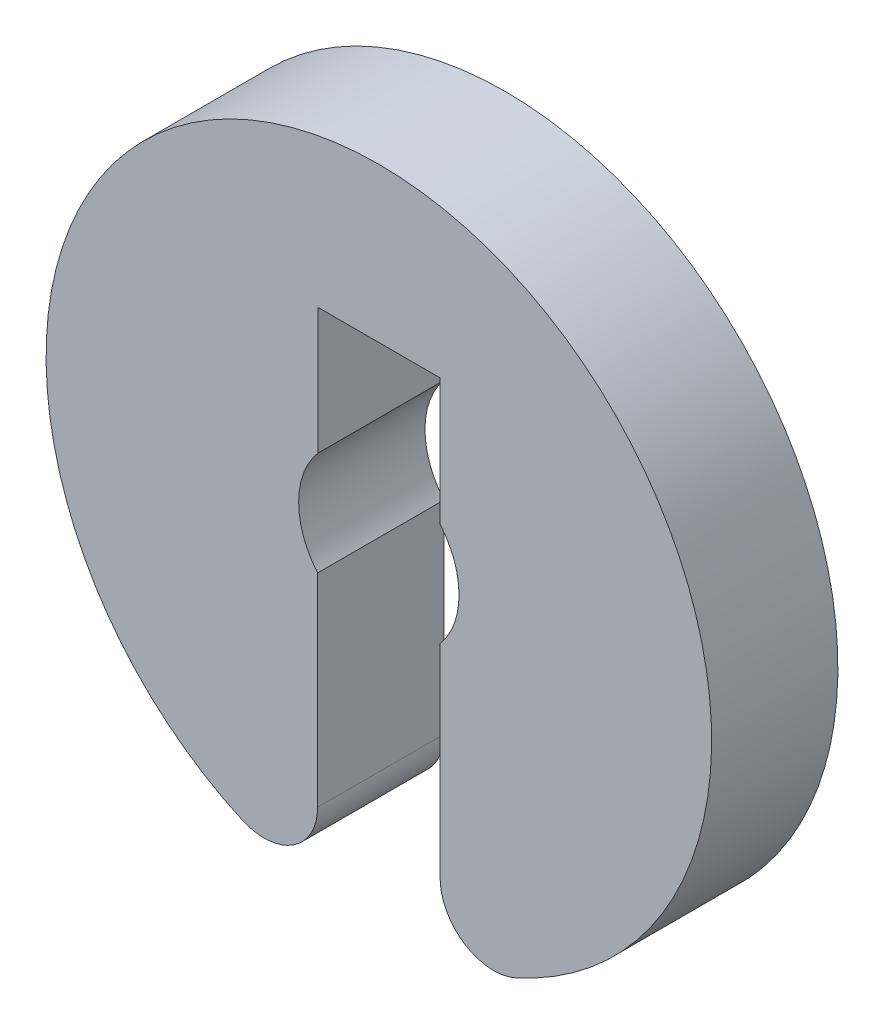
ISO-10303-21;
HEADER;
FILE_DESCRIPTION(('STEP AP214'),'2;1');
FILE_NAME('part.step','',(''),(''),'','','');
FILE_SCHEMA(('AUTOMOTIVE_DESIGN { 1 0 10303 214 1 1 1 1 }'));
ENDSEC;
DATA;
#1=APPLICATION_CONTEXT('core data for automotive mechanical design processes');
#2=APPLICATION_PROTOCOL_DEFINITION('international standard','automotive_design',2000,#1);
#3=PRODUCT_CONTEXT('',#1,'mechanical');
#4=PRODUCT('Part','Part','',(#3));
#5=PRODUCT_RELATED_PRODUCT_CATEGORY('part','',(#4));
#6=PRODUCT_DEFINITION_FORMATION('','',#4);
#7=PRODUCT_DEFINITION_CONTEXT('part definition',#1,'design');
#8=PRODUCT_DEFINITION('design','',#6,#7);
#9=PRODUCT_DEFINITION_SHAPE('','',#8);
#10=(LENGTH_UNIT() NAMED_UNIT(*) SI_UNIT(.MILLI.,.METRE.));
#11=(NAMED_UNIT(*) PLANE_ANGLE_UNIT() SI_UNIT($,.RADIAN.));
#12=(NAMED_UNIT(*) SI_UNIT($,.STERADIAN.) SOLID_ANGLE_UNIT());
#13=UNCERTAINTY_MEASURE_WITH_UNIT(LENGTH_MEASURE(1.E-05),#10,'distance_accuracy_value','');
#14=(GEOMETRIC_REPRESENTATION_CONTEXT(3) GLOBAL_UNCERTAINTY_ASSIGNED_CONTEXT((#13)) GLOBAL_UNIT_ASSIGNED_CONTEXT((#10,
#11,#12)) REPRESENTATION_CONTEXT('',''));
#15=CARTESIAN_POINT('',(0.,0.,0.));
#16=DIRECTION('',(0.,0.,1.));
#17=DIRECTION('',(1.,0.,0.));
#18=AXIS2_PLACEMENT_3D('',#15,#16,#17);
#19=CARTESIAN_POINT('',(0.,0.,3.));
#20=DIRECTION('',(0.,0.,-1.));
#21=DIRECTION('',(-1.,0.,0.));
#22=AXIS2_PLACEMENT_3D('',#19,#20,#21);
#23=CYLINDRICAL_SURFACE('',#22,1.90500000000001);
#24=CARTESIAN_POINT('',(0.,0.,0.));
#25=DIRECTION('',(0.,0.,-1.));
#26=DIRECTION('',(1.,0.,0.));
#27=AXIS2_PLACEMENT_3D('',#24,#25,#26);
#28=CIRCLE('',#27,1.90500000000001);
#29=CARTESIAN_POINT('',(1.4475,1.23845417759399,0.));
#30=VERTEX_POINT('',#29);
#31=CARTESIAN_POINT('',(1.455,-1.22963409191515,0.));
#32=VERTEX_POINT('',#31);
#33=EDGE_CURVE('E140',#30,#32,#28,.T.);
#34=ORIENTED_EDGE('',*,*,#33,.T.);
#35=DIRECTION('',(0.,0.,-1.));
#36=VECTOR('',#35,1.);
#37=CARTESIAN_POINT('',(1.455,-1.22963409191515,3.));
#38=LINE('',#37,#36);
#39=CARTESIAN_POINT('',(1.455,-1.22963409191515,3.));
#40=VERTEX_POINT('',#39);
#41=EDGE_CURVE('E122',#40,#32,#38,.T.);
#42=ORIENTED_EDGE('',*,*,#41,.F.);
#43=CARTESIAN_POINT('',(0.,0.,3.));
#44=DIRECTION('',(0.,0.,-1.));
#45=DIRECTION('',(1.,0.,0.));
#46=AXIS2_PLACEMENT_3D('',#43,#44,#45);
#47=CIRCLE('',#46,1.90500000000001);
#48=CARTESIAN_POINT('',(1.4475,1.23845417759399,3.));
#49=VERTEX_POINT('',#48);
#50=EDGE_CURVE('E130',#49,#40,#47,.T.);
#51=ORIENTED_EDGE('',*,*,#50,.F.);
#52=DIRECTION('',(0.,0.,-1.));
#53=VECTOR('',#52,1.);
#54=CARTESIAN_POINT('',(1.4475,1.23845417759399,3.));
#55=LINE('',#54,#53);
#56=EDGE_CURVE('E205',#49,#30,#55,.T.);
#57=ORIENTED_EDGE('',*,*,#56,.T.);
#58=EDGE_LOOP('',(#34,#42,#51,#57));
#59=FACE_BOUND('',#58,.T.);
#60=ADVANCED_FACE('F45',(#59),#23,.F.);
#61=CARTESIAN_POINT('',(1.455,-7.76994208472624,3.));
#62=DIRECTION('',(1.,0.,0.));
#63=DIRECTION('',(0.,0.,-1.));
#64=AXIS2_PLACEMENT_3D('',#61,#62,#63);
#65=PLANE('',#64);
#66=DIRECTION('',(0.,-1.,0.));
#67=VECTOR('',#66,1.);
#68=CARTESIAN_POINT('',(1.455,-7.76994208472624,0.));
#69=LINE('',#68,#67);
#70=CARTESIAN_POINT('',(1.455,-6.04959502776839,0.));
#71=VERTEX_POINT('',#70);
#72=EDGE_CURVE('E202',#32,#71,#69,.T.);
#73=ORIENTED_EDGE('',*,*,#72,.T.);
#74=DIRECTION('',(0.,0.,-1.));
#75=VECTOR('',#74,1.);
#76=CARTESIAN_POINT('',(1.455,-6.04959502776839,3.));
#77=LINE('',#76,#75);
#78=CARTESIAN_POINT('',(1.455,-6.04959502776839,3.));
#79=VERTEX_POINT('',#78);
#80=EDGE_CURVE('E12',#71,#79,#77,.F.);
#81=ORIENTED_EDGE('',*,*,#80,.T.);
#82=DIRECTION('',(0.,-1.,0.));
#83=VECTOR('',#82,1.);
#84=CARTESIAN_POINT('',(1.455,-7.76994208472624,3.));
#85=LINE('',#84,#83);
#86=EDGE_CURVE('E119',#40,#79,#85,.T.);
#87=ORIENTED_EDGE('',*,*,#86,.F.);
#88=ORIENTED_EDGE('',*,*,#41,.T.);
#89=EDGE_LOOP('',(#73,#81,#87,#88));
#90=FACE_BOUND('',#89,.T.);
#91=ADVANCED_FACE('F118',(#90),#65,.F.);
#92=CARTESIAN_POINT('',(0.,0.,3.));
#93=DIRECTION('',(0.,0.,-1.));
#94=DIRECTION('',(-1.,0.,0.));
#95=AXIS2_PLACEMENT_3D('',#92,#93,#94);
#96=CYLINDRICAL_SURFACE('',#95,7.905);
#97=CARTESIAN_POINT('',(0.,0.,0.));
#98=DIRECTION('',(0.,0.,1.));
#99=DIRECTION('',(-1.,0.,0.));
#100=AXIS2_PLACEMENT_3D('',#97,#98,#99);
#101=CIRCLE('',#100,7.905);
#102=CARTESIAN_POINT('',(3.24659005275057,-7.20754313406317,0.));
#103=VERTEX_POINT('',#102);
#104=CARTESIAN_POINT('',(-3.24659005275057,-7.20754313406317,0.));
#105=VERTEX_POINT('',#104);
#106=EDGE_CURVE('E210',#103,#105,#101,.T.);
#107=ORIENTED_EDGE('',*,*,#106,.T.);
#108=DIRECTION('',(0.,0.,-1.));
#109=VECTOR('',#108,1.);
#110=CARTESIAN_POINT('',(-3.24659005275057,-7.20754313406317,3.));
#111=LINE('',#110,#109);
#112=CARTESIAN_POINT('',(-3.24659005275057,-7.20754313406317,3.));
#113=VERTEX_POINT('',#112);
#114=EDGE_CURVE('E64',#105,#113,#111,.F.);
#115=ORIENTED_EDGE('',*,*,#114,.T.);
#116=CARTESIAN_POINT('',(0.,0.,3.));
#117=DIRECTION('',(0.,0.,1.));
#118=DIRECTION('',(-1.,0.,0.));
#119=AXIS2_PLACEMENT_3D('',#116,#117,#118);
#120=CIRCLE('',#119,7.905);
#121=CARTESIAN_POINT('',(3.24659005275057,-7.20754313406317,3.));
#122=VERTEX_POINT('',#121);
#123=EDGE_CURVE('E127',#122,#113,#120,.T.);
#124=ORIENTED_EDGE('',*,*,#123,.F.);
#125=DIRECTION('',(0.,0.,-1.));
#126=VECTOR('',#125,1.);
#127=CARTESIAN_POINT('',(3.24659005275057,-7.20754313406317,3.));
#128=LINE('',#127,#126);
#129=EDGE_CURVE('E152',#122,#103,#128,.T.);
#130=ORIENTED_EDGE('',*,*,#129,.T.);
#131=EDGE_LOOP('',(#107,#115,#124,#130));
#132=FACE_BOUND('',#131,.T.);
#133=ADVANCED_FACE('F250',(#132),#96,.T.);
#134=CARTESIAN_POINT('',(-1.455,-7.76994208472624,3.));
#135=DIRECTION('',(-1.,0.,0.));
#136=DIRECTION('',(0.,0.,1.));
#137=AXIS2_PLACEMENT_3D('',#134,#135,#136);
#138=PLANE('',#137);
#139=DIRECTION('',(0.,1.,0.));
#140=VECTOR('',#139,1.);
#141=CARTESIAN_POINT('',(-1.455,-7.76994208472624,3.));
#142=LINE('',#141,#140);
#143=CARTESIAN_POINT('',(-1.455,-6.04959502776839,3.));
#144=VERTEX_POINT('',#143);
#145=CARTESIAN_POINT('',(-1.455,-1.22963409191515,3.));
#146=VERTEX_POINT('',#145);
#147=EDGE_CURVE('E168',#144,#146,#142,.T.);
#148=ORIENTED_EDGE('',*,*,#147,.F.);
#149=DIRECTION('',(0.,0.,-1.));
#150=VECTOR('',#149,1.);
#151=CARTESIAN_POINT('',(-1.455,-6.04959502776839,3.));
#152=LINE('',#151,#150);
#153=CARTESIAN_POINT('',(-1.455,-6.04959502776839,0.));
#154=VERTEX_POINT('',#153);
#155=EDGE_CURVE('E136',#144,#154,#152,.T.);
#156=ORIENTED_EDGE('',*,*,#155,.T.);
#157=DIRECTION('',(0.,1.,0.));
#158=VECTOR('',#157,1.);
#159=CARTESIAN_POINT('',(-1.455,-7.76994208472624,0.));
#160=LINE('',#159,#158);
#161=CARTESIAN_POINT('',(-1.455,-1.22963409191515,0.));
#162=VERTEX_POINT('',#161);
#163=EDGE_CURVE('E207',#154,#162,#160,.T.);
#164=ORIENTED_EDGE('',*,*,#163,.T.);
#165=DIRECTION('',(0.,0.,-1.));
#166=VECTOR('',#165,1.);
#167=CARTESIAN_POINT('',(-1.455,-1.22963409191515,3.));
#168=LINE('',#167,#166);
#169=EDGE_CURVE('E143',#146,#162,#168,.T.);
#170=ORIENTED_EDGE('',*,*,#169,.F.);
#171=EDGE_LOOP('',(#148,#156,#164,#170));
#172=FACE_BOUND('',#171,.T.);
#173=ADVANCED_FACE('F254',(#172),#138,.F.);
#174=CARTESIAN_POINT('',(0.,0.,3.));
#175=DIRECTION('',(0.,0.,-1.));
#176=DIRECTION('',(-1.,0.,0.));
#177=AXIS2_PLACEMENT_3D('',#174,#175,#176);
#178=CYLINDRICAL_SURFACE('',#177,1.90500000000001);
#179=CARTESIAN_POINT('',(0.,0.,0.));
#180=DIRECTION('',(0.,0.,-1.));
#181=DIRECTION('',(1.,0.,0.));
#182=AXIS2_PLACEMENT_3D('',#179,#180,#181);
#183=CIRCLE('',#182,1.90500000000001);
#184=CARTESIAN_POINT('',(-1.4475,1.23845417759399,0.));
#185=VERTEX_POINT('',#184);
#186=EDGE_CURVE('E211',#162,#185,#183,.T.);
#187=ORIENTED_EDGE('',*,*,#186,.T.);
#188=DIRECTION('',(0.,0.,-1.));
#189=VECTOR('',#188,1.);
#190=CARTESIAN_POINT('',(-1.4475,1.23845417759399,3.));
#191=LINE('',#190,#189);
#192=CARTESIAN_POINT('',(-1.4475,1.23845417759399,3.));
#193=VERTEX_POINT('',#192);
#194=EDGE_CURVE('E150',#193,#185,#191,.T.);
#195=ORIENTED_EDGE('',*,*,#194,.F.);
#196=CARTESIAN_POINT('',(0.,0.,3.));
#197=DIRECTION('',(0.,0.,-1.));
#198=DIRECTION('',(1.,0.,0.));
#199=AXIS2_PLACEMENT_3D('',#196,#197,#198);
#200=CIRCLE('',#199,1.90500000000001);
#201=EDGE_CURVE('E185',#146,#193,#200,.T.);
#202=ORIENTED_EDGE('',*,*,#201,.F.);
#203=ORIENTED_EDGE('',*,*,#169,.T.);
#204=EDGE_LOOP('',(#187,#195,#202,#203));
#205=FACE_BOUND('',#204,.T.);
#206=ADVANCED_FACE('F260',(#205),#178,.F.);
#207=CARTESIAN_POINT('',(-1.4475,4.23845417759399,3.));
#208=DIRECTION('',(-1.,0.,0.));
#209=DIRECTION('',(0.,-1.,0.));
#210=AXIS2_PLACEMENT_3D('',#207,#208,#209);
#211=PLANE('',#210);
#212=DIRECTION('',(0.,1.,0.));
#213=VECTOR('',#212,1.);
#214=CARTESIAN_POINT('',(-1.4475,4.23845417759399,0.));
#215=LINE('',#214,#213);
#216=CARTESIAN_POINT('',(-1.4475,4.23845417759399,0.));
#217=VERTEX_POINT('',#216);
#218=EDGE_CURVE('E213',#185,#217,#215,.T.);
#219=ORIENTED_EDGE('',*,*,#218,.T.);
#220=DIRECTION('',(0.,0.,-1.));
#221=VECTOR('',#220,1.);
#222=CARTESIAN_POINT('',(-1.4475,4.23845417759399,3.));
#223=LINE('',#222,#221);
#224=CARTESIAN_POINT('',(-1.4475,4.23845417759399,3.));
#225=VERTEX_POINT('',#224);
#226=EDGE_CURVE('E225',#225,#217,#223,.T.);
#227=ORIENTED_EDGE('',*,*,#226,.F.);
#228=DIRECTION('',(0.,1.,0.));
#229=VECTOR('',#228,1.);
#230=CARTESIAN_POINT('',(-1.4475,4.23845417759399,3.));
#231=LINE('',#230,#229);
#232=EDGE_CURVE('E184',#193,#225,#231,.T.);
#233=ORIENTED_EDGE('',*,*,#232,.F.);
#234=ORIENTED_EDGE('',*,*,#194,.T.);
#235=EDGE_LOOP('',(#219,#227,#233,#234));
#236=FACE_BOUND('',#235,.T.);
#237=ADVANCED_FACE('F226',(#236),#211,.F.);
#238=CARTESIAN_POINT('',(-1.4475,4.23845417759399,3.));
#239=DIRECTION('',(0.,1.,0.));
#240=DIRECTION('',(-1.,0.,0.));
#241=AXIS2_PLACEMENT_3D('',#238,#239,#240);
#242=PLANE('',#241);
#243=DIRECTION('',(1.,0.,0.));
#244=VECTOR('',#243,1.);
#245=CARTESIAN_POINT('',(-1.4475,4.23845417759399,0.));
#246=LINE('',#245,#244);
#247=CARTESIAN_POINT('',(1.4475,4.23845417759399,0.));
#248=VERTEX_POINT('',#247);
#249=EDGE_CURVE('E214',#217,#248,#246,.T.);
#250=ORIENTED_EDGE('',*,*,#249,.T.);
#251=DIRECTION('',(0.,0.,-1.));
#252=VECTOR('',#251,1.);
#253=CARTESIAN_POINT('',(1.4475,4.23845417759399,3.));
#254=LINE('',#253,#252);
#255=CARTESIAN_POINT('',(1.4475,4.23845417759399,3.));
#256=VERTEX_POINT('',#255);
#257=EDGE_CURVE('E218',#256,#248,#254,.T.);
#258=ORIENTED_EDGE('',*,*,#257,.F.);
#259=DIRECTION('',(1.,0.,0.));
#260=VECTOR('',#259,1.);
#261=CARTESIAN_POINT('',(-1.4475,4.23845417759399,3.));
#262=LINE('',#261,#260);
#263=EDGE_CURVE('E195',#225,#256,#262,.T.);
#264=ORIENTED_EDGE('',*,*,#263,.F.);
#265=ORIENTED_EDGE('',*,*,#226,.T.);
#266=EDGE_LOOP('',(#250,#258,#264,#265));
#267=FACE_BOUND('',#266,.T.);
#268=ADVANCED_FACE('F242',(#267),#242,.F.);
#269=CARTESIAN_POINT('',(1.4475,4.23845417759399,3.));
#270=DIRECTION('',(1.,0.,0.));
#271=DIRECTION('',(0.,1.,0.));
#272=AXIS2_PLACEMENT_3D('',#269,#270,#271);
#273=PLANE('',#272);
#274=DIRECTION('',(0.,-1.,0.));
#275=VECTOR('',#274,1.);
#276=CARTESIAN_POINT('',(1.4475,4.23845417759399,0.));
#277=LINE('',#276,#275);
#278=EDGE_CURVE('E138',#248,#30,#277,.T.);
#279=ORIENTED_EDGE('',*,*,#278,.T.);
#280=ORIENTED_EDGE('',*,*,#56,.F.);
#281=DIRECTION('',(0.,-1.,0.));
#282=VECTOR('',#281,1.);
#283=CARTESIAN_POINT('',(1.4475,4.23845417759399,3.));
#284=LINE('',#283,#282);
#285=EDGE_CURVE('E135',#256,#49,#284,.T.);
#286=ORIENTED_EDGE('',*,*,#285,.F.);
#287=ORIENTED_EDGE('',*,*,#257,.T.);
#288=EDGE_LOOP('',(#279,#280,#286,#287));
#289=FACE_BOUND('',#288,.T.);
#290=ADVANCED_FACE('F241',(#289),#273,.F.);
#291=CARTESIAN_POINT('',(0.,0.,3.));
#292=DIRECTION('',(0.,0.,1.));
#293=DIRECTION('',(1.,0.,0.));
#294=AXIS2_PLACEMENT_3D('',#291,#292,#293);
#295=PLANE('',#294);
#296=ORIENTED_EDGE('',*,*,#123,.T.);
#297=CARTESIAN_POINT('',(-2.725,-6.04959502776839,3.));
#298=DIRECTION('',(0.,0.,1.));
#299=DIRECTION('',(1.,0.,0.));
#300=AXIS2_PLACEMENT_3D('',#297,#298,#299);
#301=CIRCLE('',#300,1.27);
#302=EDGE_CURVE('E49',#113,#144,#301,.T.);
#303=ORIENTED_EDGE('',*,*,#302,.T.);
#304=ORIENTED_EDGE('',*,*,#147,.T.);
#305=ORIENTED_EDGE('',*,*,#201,.T.);
#306=ORIENTED_EDGE('',*,*,#232,.T.);
#307=ORIENTED_EDGE('',*,*,#263,.T.);
#308=ORIENTED_EDGE('',*,*,#285,.T.);
#309=ORIENTED_EDGE('',*,*,#50,.T.);
#310=ORIENTED_EDGE('',*,*,#86,.T.);
#311=CARTESIAN_POINT('',(2.725,-6.04959502776839,3.));
#312=DIRECTION('',(0.,0.,1.));
#313=DIRECTION('',(1.,0.,0.));
#314=AXIS2_PLACEMENT_3D('',#311,#312,#313);
#315=CIRCLE('',#314,1.27);
#316=EDGE_CURVE('E160',#79,#122,#315,.T.);
#317=ORIENTED_EDGE('',*,*,#316,.T.);
#318=EDGE_LOOP('',(#296,#303,#304,#305,#306,#307,#308,#309,#310,#317));
#319=FACE_BOUND('',#318,.T.);
#320=ADVANCED_FACE('F128',(#319),#295,.T.);
#321=CARTESIAN_POINT('',(0.,0.,0.));
#322=DIRECTION('',(0.,0.,1.));
#323=DIRECTION('',(1.,0.,0.));
#324=AXIS2_PLACEMENT_3D('',#321,#322,#323);
#325=PLANE('',#324);
#326=ORIENTED_EDGE('',*,*,#163,.F.);
#327=CARTESIAN_POINT('',(-2.725,-6.04959502776839,0.));
#328=DIRECTION('',(0.,0.,1.));
#329=DIRECTION('',(1.,0.,0.));
#330=AXIS2_PLACEMENT_3D('',#327,#328,#329);
#331=CIRCLE('',#330,1.27);
#332=EDGE_CURVE('E155',#154,#105,#331,.F.);
#333=ORIENTED_EDGE('',*,*,#332,.T.);
#334=ORIENTED_EDGE('',*,*,#106,.F.);
#335=CARTESIAN_POINT('',(2.725,-6.04959502776839,0.));
#336=DIRECTION('',(0.,0.,1.));
#337=DIRECTION('',(1.,0.,0.));
#338=AXIS2_PLACEMENT_3D('',#335,#336,#337);
#339=CIRCLE('',#338,1.27);
#340=EDGE_CURVE('E145',#103,#71,#339,.F.);
#341=ORIENTED_EDGE('',*,*,#340,.T.);
#342=ORIENTED_EDGE('',*,*,#72,.F.);
#343=ORIENTED_EDGE('',*,*,#33,.F.);
#344=ORIENTED_EDGE('',*,*,#278,.F.);
#345=ORIENTED_EDGE('',*,*,#249,.F.);
#346=ORIENTED_EDGE('',*,*,#218,.F.);
#347=ORIENTED_EDGE('',*,*,#186,.F.);
#348=EDGE_LOOP('',(#326,#333,#334,#341,#342,#343,#344,#345,#346,#347));
#349=FACE_BOUND('',#348,.T.);
#350=ADVANCED_FACE('F240',(#349),#325,.F.);
#351=CARTESIAN_POINT('',(-2.725,-6.04959502776839,3.));
#352=DIRECTION('',(0.,0.,-1.));
#353=DIRECTION('',(-1.,0.,0.));
#354=AXIS2_PLACEMENT_3D('',#351,#352,#353);
#355=CYLINDRICAL_SURFACE('',#354,1.27);
#356=ORIENTED_EDGE('',*,*,#302,.F.);
#357=ORIENTED_EDGE('',*,*,#114,.F.);
#358=ORIENTED_EDGE('',*,*,#332,.F.);
#359=ORIENTED_EDGE('',*,*,#155,.F.);
#360=EDGE_LOOP('',(#356,#357,#358,#359));
#361=FACE_BOUND('',#360,.T.);
#362=ADVANCED_FACE('F252',(#361),#355,.T.);
#363=CARTESIAN_POINT('',(2.725,-6.04959502776839,3.));
#364=DIRECTION('',(0.,0.,-1.));
#365=DIRECTION('',(-1.,0.,0.));
#366=AXIS2_PLACEMENT_3D('',#363,#364,#365);
#367=CYLINDRICAL_SURFACE('',#366,1.27);
#368=ORIENTED_EDGE('',*,*,#316,.F.);
#369=ORIENTED_EDGE('',*,*,#80,.F.);
#370=ORIENTED_EDGE('',*,*,#340,.F.);
#371=ORIENTED_EDGE('',*,*,#129,.F.);
#372=EDGE_LOOP('',(#368,#369,#370,#371));
#373=FACE_BOUND('',#372,.T.);
#374=ADVANCED_FACE('F42',(#373),#367,.T.);
#375=CLOSED_SHELL('',(#60,#91,#133,#173,#206,#237,#268,#290,#320,#350,#362,#374));
#376=MANIFOLD_SOLID_BREP('B2',#375);
#377=ADVANCED_BREP_SHAPE_REPRESENTATION('',(#18,#376),#14);
#378=SHAPE_DEFINITION_REPRESENTATION(#9,#377);
ENDSEC;
END-ISO-10303-21;
